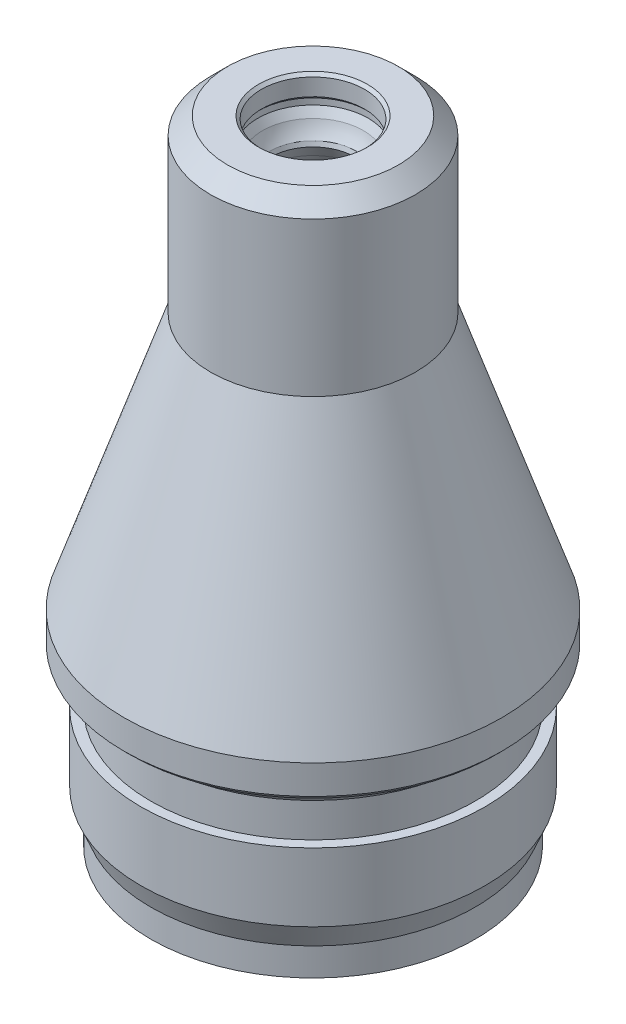
ISO-10303-21;
HEADER;
FILE_DESCRIPTION(('STEP AP214'),'2;1');
FILE_NAME('part.step','',(''),(''),'','','');
FILE_SCHEMA(('AUTOMOTIVE_DESIGN { 1 0 10303 214 1 1 1 1 }'));
ENDSEC;
DATA;
#1=APPLICATION_CONTEXT('core data for automotive mechanical design processes');
#2=APPLICATION_PROTOCOL_DEFINITION('international standard','automotive_design',2000,#1);
#3=PRODUCT_CONTEXT('',#1,'mechanical');
#4=PRODUCT('Part','Part','',(#3));
#5=PRODUCT_RELATED_PRODUCT_CATEGORY('part','',(#4));
#6=PRODUCT_DEFINITION_FORMATION('','',#4);
#7=PRODUCT_DEFINITION_CONTEXT('part definition',#1,'design');
#8=PRODUCT_DEFINITION('design','',#6,#7);
#9=PRODUCT_DEFINITION_SHAPE('','',#8);
#10=(LENGTH_UNIT() NAMED_UNIT(*) SI_UNIT(.MILLI.,.METRE.));
#11=(NAMED_UNIT(*) PLANE_ANGLE_UNIT() SI_UNIT($,.RADIAN.));
#12=(NAMED_UNIT(*) SI_UNIT($,.STERADIAN.) SOLID_ANGLE_UNIT());
#13=UNCERTAINTY_MEASURE_WITH_UNIT(LENGTH_MEASURE(1.E-05),#10,'distance_accuracy_value','');
#14=(GEOMETRIC_REPRESENTATION_CONTEXT(3) GLOBAL_UNCERTAINTY_ASSIGNED_CONTEXT((#13)) GLOBAL_UNIT_ASSIGNED_CONTEXT((#10,
#11,#12)) REPRESENTATION_CONTEXT('',''));
#15=CARTESIAN_POINT('',(0.,0.,0.));
#16=DIRECTION('',(0.,0.,1.));
#17=DIRECTION('',(1.,0.,0.));
#18=AXIS2_PLACEMENT_3D('',#15,#16,#17);
#19=CARTESIAN_POINT('',(0.,-2.,-9.5));
#20=DIRECTION('',(0.,-1.,0.));
#21=DIRECTION('',(0.,0.,-1.));
#22=AXIS2_PLACEMENT_3D('',#19,#20,#21);
#23=PLANE('',#22);
#24=CARTESIAN_POINT('',(0.,-2.,0.));
#25=DIRECTION('',(0.,-1.,0.));
#26=DIRECTION('',(0.,0.,-1.));
#27=AXIS2_PLACEMENT_3D('',#24,#25,#26);
#28=CIRCLE('',#27,5.20000000000001);
#29=CARTESIAN_POINT('',(0.,-2.,-5.20000000000001));
#30=VERTEX_POINT('',#29);
#31=EDGE_CURVE('E57',#30,#30,#28,.F.);
#32=ORIENTED_EDGE('',*,*,#31,.T.);
#33=EDGE_LOOP('',(#32));
#34=FACE_BOUND('',#33,.T.);
#35=CARTESIAN_POINT('',(0.,-2.,0.));
#36=DIRECTION('',(0.,-1.,0.));
#37=DIRECTION('',(0.,0.,-1.));
#38=AXIS2_PLACEMENT_3D('',#35,#36,#37);
#39=CIRCLE('',#38,9.5);
#40=CARTESIAN_POINT('',(0.,-2.,-9.5));
#41=VERTEX_POINT('',#40);
#42=EDGE_CURVE('E63',#41,#41,#39,.T.);
#43=ORIENTED_EDGE('',*,*,#42,.T.);
#44=EDGE_LOOP('',(#43));
#45=FACE_BOUND('',#44,.T.);
#46=ADVANCED_FACE('F31',(#34,#45),#23,.T.);
#47=CARTESIAN_POINT('',(0.,0.,0.));
#48=DIRECTION('',(0.,-1.,0.));
#49=DIRECTION('',(0.,0.,-1.));
#50=AXIS2_PLACEMENT_3D('',#47,#48,#49);
#51=CYLINDRICAL_SURFACE('',#50,9.5);
#52=CARTESIAN_POINT('',(0.,-0.374573667500014,0.));
#53=DIRECTION('',(0.,-1.,0.));
#54=DIRECTION('',(0.,0.,-1.));
#55=AXIS2_PLACEMENT_3D('',#52,#53,#54);
#56=CIRCLE('',#55,9.5);
#57=CARTESIAN_POINT('',(0.,-0.374573667500014,-9.5));
#58=VERTEX_POINT('',#57);
#59=EDGE_CURVE('E66',#58,#58,#56,.T.);
#60=ORIENTED_EDGE('',*,*,#59,.T.);
#61=EDGE_LOOP('',(#60));
#62=FACE_BOUND('',#61,.T.);
#63=ORIENTED_EDGE('',*,*,#42,.F.);
#64=EDGE_LOOP('',(#63));
#65=FACE_BOUND('',#64,.T.);
#66=ADVANCED_FACE('F169',(#62,#65),#51,.T.);
#67=CARTESIAN_POINT('',(0.,-0.374573667500014,0.));
#68=DIRECTION('',(0.,1.,0.));
#69=DIRECTION('',(0.,0.,1.));
#70=AXIS2_PLACEMENT_3D('',#67,#68,#69);
#71=CONICAL_SURFACE('',#70,9.5,0.396191832514658);
#72=CARTESIAN_POINT('',(0.,1.,0.));
#73=DIRECTION('',(0.,-1.,0.));
#74=DIRECTION('',(0.,0.,-1.));
#75=AXIS2_PLACEMENT_3D('',#72,#73,#74);
#76=CIRCLE('',#75,10.075);
#77=CARTESIAN_POINT('',(0.,1.,-10.075));
#78=VERTEX_POINT('',#77);
#79=EDGE_CURVE('E69',#78,#78,#76,.T.);
#80=ORIENTED_EDGE('',*,*,#79,.T.);
#81=EDGE_LOOP('',(#80));
#82=FACE_BOUND('',#81,.T.);
#83=ORIENTED_EDGE('',*,*,#59,.F.);
#84=EDGE_LOOP('',(#83));
#85=FACE_BOUND('',#84,.T.);
#86=ADVANCED_FACE('F175',(#82,#85),#71,.T.);
#87=CARTESIAN_POINT('',(0.,0.,0.));
#88=DIRECTION('',(0.,-1.,0.));
#89=DIRECTION('',(0.,0.,-1.));
#90=AXIS2_PLACEMENT_3D('',#87,#88,#89);
#91=CYLINDRICAL_SURFACE('',#90,10.075);
#92=CARTESIAN_POINT('',(0.,5.,0.));
#93=DIRECTION('',(0.,-1.,0.));
#94=DIRECTION('',(0.,0.,-1.));
#95=AXIS2_PLACEMENT_3D('',#92,#93,#94);
#96=CIRCLE('',#95,10.075);
#97=CARTESIAN_POINT('',(0.,5.,-10.075));
#98=VERTEX_POINT('',#97);
#99=EDGE_CURVE('E72',#98,#98,#96,.T.);
#100=ORIENTED_EDGE('',*,*,#99,.T.);
#101=EDGE_LOOP('',(#100));
#102=FACE_BOUND('',#101,.T.);
#103=ORIENTED_EDGE('',*,*,#79,.F.);
#104=EDGE_LOOP('',(#103));
#105=FACE_BOUND('',#104,.T.);
#106=ADVANCED_FACE('F263',(#102,#105),#91,.T.);
#107=CARTESIAN_POINT('',(0.,5.,-9.5));
#108=DIRECTION('',(0.,1.,0.));
#109=DIRECTION('',(0.,0.,1.));
#110=AXIS2_PLACEMENT_3D('',#107,#108,#109);
#111=PLANE('',#110);
#112=CARTESIAN_POINT('',(0.,5.,0.));
#113=DIRECTION('',(0.,-1.,0.));
#114=DIRECTION('',(0.,0.,-1.));
#115=AXIS2_PLACEMENT_3D('',#112,#113,#114);
#116=CIRCLE('',#115,9.5);
#117=CARTESIAN_POINT('',(0.,5.,-9.5));
#118=VERTEX_POINT('',#117);
#119=EDGE_CURVE('E75',#118,#118,#116,.T.);
#120=ORIENTED_EDGE('',*,*,#119,.T.);
#121=EDGE_LOOP('',(#120));
#122=FACE_BOUND('',#121,.T.);
#123=ORIENTED_EDGE('',*,*,#99,.F.);
#124=EDGE_LOOP('',(#123));
#125=FACE_BOUND('',#124,.T.);
#126=ADVANCED_FACE('F259',(#122,#125),#111,.T.);
#127=CARTESIAN_POINT('',(0.,0.,0.));
#128=DIRECTION('',(0.,-1.,0.));
#129=DIRECTION('',(0.,0.,-1.));
#130=AXIS2_PLACEMENT_3D('',#127,#128,#129);
#131=CYLINDRICAL_SURFACE('',#130,9.5);
#132=CARTESIAN_POINT('',(0.,7.,0.));
#133=DIRECTION('',(0.,-1.,0.));
#134=DIRECTION('',(0.,0.,-1.));
#135=AXIS2_PLACEMENT_3D('',#132,#133,#134);
#136=CIRCLE('',#135,9.5);
#137=CARTESIAN_POINT('',(0.,7.,-9.5));
#138=VERTEX_POINT('',#137);
#139=EDGE_CURVE('E78',#138,#138,#136,.T.);
#140=ORIENTED_EDGE('',*,*,#139,.T.);
#141=EDGE_LOOP('',(#140));
#142=FACE_BOUND('',#141,.T.);
#143=ORIENTED_EDGE('',*,*,#119,.F.);
#144=EDGE_LOOP('',(#143));
#145=FACE_BOUND('',#144,.T.);
#146=ADVANCED_FACE('F255',(#142,#145),#131,.T.);
#147=CARTESIAN_POINT('',(0.,7.,0.));
#148=DIRECTION('',(0.,1.,0.));
#149=DIRECTION('',(0.,0.,1.));
#150=AXIS2_PLACEMENT_3D('',#147,#148,#149);
#151=CONICAL_SURFACE('',#150,9.5,0.502843210927853);
#152=CARTESIAN_POINT('',(0.,8.00000000000002,0.));
#153=DIRECTION('',(0.,-1.,0.));
#154=DIRECTION('',(0.,0.,-1.));
#155=AXIS2_PLACEMENT_3D('',#152,#153,#154);
#156=CIRCLE('',#155,10.05);
#157=CARTESIAN_POINT('',(0.,8.00000000000002,-10.05));
#158=VERTEX_POINT('',#157);
#159=EDGE_CURVE('E81',#158,#158,#156,.T.);
#160=ORIENTED_EDGE('',*,*,#159,.T.);
#161=EDGE_LOOP('',(#160));
#162=FACE_BOUND('',#161,.T.);
#163=ORIENTED_EDGE('',*,*,#139,.F.);
#164=EDGE_LOOP('',(#163));
#165=FACE_BOUND('',#164,.T.);
#166=ADVANCED_FACE('F252',(#162,#165),#151,.T.);
#167=CARTESIAN_POINT('',(0.,8.00000000000002,-11.05));
#168=DIRECTION('',(0.,-1.,0.));
#169=DIRECTION('',(0.,0.,-1.));
#170=AXIS2_PLACEMENT_3D('',#167,#168,#169);
#171=PLANE('',#170);
#172=CARTESIAN_POINT('',(0.,8.00000000000002,0.));
#173=DIRECTION('',(0.,-1.,0.));
#174=DIRECTION('',(0.,0.,-1.));
#175=AXIS2_PLACEMENT_3D('',#172,#173,#174);
#176=CIRCLE('',#175,10.75);
#177=CARTESIAN_POINT('',(0.,8.00000000000002,-10.75));
#178=VERTEX_POINT('',#177);
#179=EDGE_CURVE('E38',#178,#178,#176,.T.);
#180=ORIENTED_EDGE('',*,*,#179,.T.);
#181=EDGE_LOOP('',(#180));
#182=FACE_BOUND('',#181,.T.);
#183=ORIENTED_EDGE('',*,*,#159,.F.);
#184=EDGE_LOOP('',(#183));
#185=FACE_BOUND('',#184,.T.);
#186=ADVANCED_FACE('F249',(#182,#185),#171,.T.);
#187=CARTESIAN_POINT('',(0.,0.,0.));
#188=DIRECTION('',(0.,-1.,0.));
#189=DIRECTION('',(0.,0.,-1.));
#190=AXIS2_PLACEMENT_3D('',#187,#188,#189);
#191=CYLINDRICAL_SURFACE('',#190,11.05);
#192=CARTESIAN_POINT('',(0.,8.30000000000001,0.));
#193=DIRECTION('',(0.,-1.,0.));
#194=DIRECTION('',(0.,0.,-1.));
#195=AXIS2_PLACEMENT_3D('',#192,#193,#194);
#196=CIRCLE('',#195,11.05);
#197=CARTESIAN_POINT('',(0.,8.30000000000001,-11.05));
#198=VERTEX_POINT('',#197);
#199=EDGE_CURVE('E10',#198,#198,#196,.F.);
#200=ORIENTED_EDGE('',*,*,#199,.T.);
#201=EDGE_LOOP('',(#200));
#202=FACE_BOUND('',#201,.T.);
#203=CARTESIAN_POINT('',(0.,10.,0.));
#204=DIRECTION('',(0.,-1.,0.));
#205=DIRECTION('',(0.,0.,-1.));
#206=AXIS2_PLACEMENT_3D('',#203,#204,#205);
#207=CIRCLE('',#206,11.05);
#208=CARTESIAN_POINT('',(0.,10.,-11.05));
#209=VERTEX_POINT('',#208);
#210=EDGE_CURVE('E84',#209,#209,#207,.T.);
#211=ORIENTED_EDGE('',*,*,#210,.T.);
#212=EDGE_LOOP('',(#211));
#213=FACE_BOUND('',#212,.T.);
#214=ADVANCED_FACE('F245',(#202,#213),#191,.T.);
#215=CARTESIAN_POINT('',(0.,10.,0.));
#216=DIRECTION('',(0.,-1.,0.));
#217=DIRECTION('',(0.,0.,-1.));
#218=AXIS2_PLACEMENT_3D('',#215,#216,#217);
#219=CONICAL_SURFACE('',#218,11.05,0.32474754842064);
#220=CARTESIAN_POINT('',(0.,25.,0.));
#221=DIRECTION('',(0.,-1.,0.));
#222=DIRECTION('',(0.,0.,-1.));
#223=AXIS2_PLACEMENT_3D('',#220,#221,#222);
#224=CIRCLE('',#223,6.);
#225=CARTESIAN_POINT('',(0.,25.,-6.));
#226=VERTEX_POINT('',#225);
#227=EDGE_CURVE('E87',#226,#226,#224,.T.);
#228=ORIENTED_EDGE('',*,*,#227,.T.);
#229=EDGE_LOOP('',(#228));
#230=FACE_BOUND('',#229,.T.);
#231=ORIENTED_EDGE('',*,*,#210,.F.);
#232=EDGE_LOOP('',(#231));
#233=FACE_BOUND('',#232,.T.);
#234=ADVANCED_FACE('F239',(#230,#233),#219,.T.);
#235=CARTESIAN_POINT('',(0.,0.,0.));
#236=DIRECTION('',(0.,-1.,0.));
#237=DIRECTION('',(0.,0.,-1.));
#238=AXIS2_PLACEMENT_3D('',#235,#236,#237);
#239=CYLINDRICAL_SURFACE('',#238,6.);
#240=CARTESIAN_POINT('',(0.,34.,0.));
#241=DIRECTION('',(0.,1.,0.));
#242=DIRECTION('',(0.,0.,1.));
#243=AXIS2_PLACEMENT_3D('',#240,#241,#242);
#244=CIRCLE('',#243,6.);
#245=CARTESIAN_POINT('',(0.,34.,6.));
#246=VERTEX_POINT('',#245);
#247=EDGE_CURVE('E54',#246,#246,#244,.F.);
#248=ORIENTED_EDGE('',*,*,#247,.T.);
#249=EDGE_LOOP('',(#248));
#250=FACE_BOUND('',#249,.T.);
#251=ORIENTED_EDGE('',*,*,#227,.F.);
#252=EDGE_LOOP('',(#251));
#253=FACE_BOUND('',#252,.T.);
#254=ADVANCED_FACE('F233',(#250,#253),#239,.T.);
#255=CARTESIAN_POINT('',(0.,35.,-3.18963158426858));
#256=DIRECTION('',(0.,1.,0.));
#257=DIRECTION('',(0.,0.,1.));
#258=AXIS2_PLACEMENT_3D('',#255,#256,#257);
#259=PLANE('',#258);
#260=CARTESIAN_POINT('',(0.,35.,0.));
#261=DIRECTION('',(0.,1.,0.));
#262=DIRECTION('',(0.,0.,1.));
#263=AXIS2_PLACEMENT_3D('',#260,#261,#262);
#264=CIRCLE('',#263,4.99999999999999);
#265=CARTESIAN_POINT('',(0.,35.,4.99999999999999));
#266=VERTEX_POINT('',#265);
#267=EDGE_CURVE('E51',#266,#266,#264,.T.);
#268=ORIENTED_EDGE('',*,*,#267,.T.);
#269=EDGE_LOOP('',(#268));
#270=FACE_BOUND('',#269,.T.);
#271=CARTESIAN_POINT('',(0.,35.,0.));
#272=DIRECTION('',(0.,-1.,0.));
#273=DIRECTION('',(0.,0.,-1.));
#274=AXIS2_PLACEMENT_3D('',#271,#272,#273);
#275=CIRCLE('',#274,3.18963158426858);
#276=CARTESIAN_POINT('',(0.,35.,-3.18963158426858));
#277=VERTEX_POINT('',#276);
#278=EDGE_CURVE('E90',#277,#277,#275,.T.);
#279=ORIENTED_EDGE('',*,*,#278,.T.);
#280=EDGE_LOOP('',(#279));
#281=FACE_BOUND('',#280,.T.);
#282=ADVANCED_FACE('F228',(#270,#281),#259,.T.);
#283=CARTESIAN_POINT('',(0.,35.,0.));
#284=DIRECTION('',(0.,1.,0.));
#285=DIRECTION('',(0.,0.,1.));
#286=AXIS2_PLACEMENT_3D('',#283,#284,#285);
#287=CONICAL_SURFACE('',#286,3.18963158426858,0.785398163397438);
#288=CARTESIAN_POINT('',(0.,34.8303684157314,0.));
#289=DIRECTION('',(0.,-1.,0.));
#290=DIRECTION('',(0.,0.,-1.));
#291=AXIS2_PLACEMENT_3D('',#288,#289,#290);
#292=CIRCLE('',#291,3.02);
#293=CARTESIAN_POINT('',(0.,34.8303684157314,-3.02));
#294=VERTEX_POINT('',#293);
#295=EDGE_CURVE('E93',#294,#294,#292,.T.);
#296=ORIENTED_EDGE('',*,*,#295,.T.);
#297=EDGE_LOOP('',(#296));
#298=FACE_BOUND('',#297,.T.);
#299=ORIENTED_EDGE('',*,*,#278,.F.);
#300=EDGE_LOOP('',(#299));
#301=FACE_BOUND('',#300,.T.);
#302=ADVANCED_FACE('F222',(#298,#301),#287,.F.);
#303=CARTESIAN_POINT('',(0.,0.,0.));
#304=DIRECTION('',(0.,-1.,0.));
#305=DIRECTION('',(0.,0.,-1.));
#306=AXIS2_PLACEMENT_3D('',#303,#304,#305);
#307=CYLINDRICAL_SURFACE('',#306,3.02);
#308=CARTESIAN_POINT('',(0.,33.8303684157314,0.));
#309=DIRECTION('',(0.,-1.,0.));
#310=DIRECTION('',(0.,0.,-1.));
#311=AXIS2_PLACEMENT_3D('',#308,#309,#310);
#312=CIRCLE('',#311,3.02);
#313=CARTESIAN_POINT('',(0.,33.8303684157314,-3.02));
#314=VERTEX_POINT('',#313);
#315=EDGE_CURVE('E96',#314,#314,#312,.T.);
#316=ORIENTED_EDGE('',*,*,#315,.T.);
#317=EDGE_LOOP('',(#316));
#318=FACE_BOUND('',#317,.T.);
#319=ORIENTED_EDGE('',*,*,#295,.F.);
#320=EDGE_LOOP('',(#319));
#321=FACE_BOUND('',#320,.T.);
#322=ADVANCED_FACE('F216',(#318,#321),#307,.F.);
#323=CARTESIAN_POINT('',(0.,33.8303684157314,0.));
#324=DIRECTION('',(0.,-1.,0.));
#325=DIRECTION('',(0.,0.,-1.));
#326=AXIS2_PLACEMENT_3D('',#323,#324,#325);
#327=CONICAL_SURFACE('',#326,3.02,0.785398163397453);
#328=CARTESIAN_POINT('',(0.,33.6203777303055,0.));
#329=DIRECTION('',(0.,-1.,0.));
#330=DIRECTION('',(0.,0.,-1.));
#331=AXIS2_PLACEMENT_3D('',#328,#329,#330);
#332=CIRCLE('',#331,3.22999068542591);
#333=CARTESIAN_POINT('',(0.,33.6203777303055,-3.22999068542591));
#334=VERTEX_POINT('',#333);
#335=EDGE_CURVE('E99',#334,#334,#332,.T.);
#336=ORIENTED_EDGE('',*,*,#335,.T.);
#337=EDGE_LOOP('',(#336));
#338=FACE_BOUND('',#337,.T.);
#339=ORIENTED_EDGE('',*,*,#315,.F.);
#340=EDGE_LOOP('',(#339));
#341=FACE_BOUND('',#340,.T.);
#342=ADVANCED_FACE('F210',(#338,#341),#327,.F.);
#343=CARTESIAN_POINT('',(0.,0.,0.));
#344=DIRECTION('',(0.,-1.,0.));
#345=DIRECTION('',(0.,0.,-1.));
#346=AXIS2_PLACEMENT_3D('',#343,#344,#345);
#347=CYLINDRICAL_SURFACE('',#346,3.22999068542591);
#348=CARTESIAN_POINT('',(0.,33.2603970035526,0.));
#349=DIRECTION('',(0.,-1.,0.));
#350=DIRECTION('',(0.,0.,-1.));
#351=AXIS2_PLACEMENT_3D('',#348,#349,#350);
#352=CIRCLE('',#351,3.22999068542591);
#353=CARTESIAN_POINT('',(0.,33.2603970035526,-3.22999068542591));
#354=VERTEX_POINT('',#353);
#355=EDGE_CURVE('E102',#354,#354,#352,.T.);
#356=ORIENTED_EDGE('',*,*,#355,.T.);
#357=EDGE_LOOP('',(#356));
#358=FACE_BOUND('',#357,.T.);
#359=ORIENTED_EDGE('',*,*,#335,.F.);
#360=EDGE_LOOP('',(#359));
#361=FACE_BOUND('',#360,.T.);
#362=ADVANCED_FACE('F204',(#358,#361),#347,.F.);
#363=CARTESIAN_POINT('',(0.,33.2603970035526,0.));
#364=DIRECTION('',(0.,1.,0.));
#365=DIRECTION('',(0.,0.,1.));
#366=AXIS2_PLACEMENT_3D('',#363,#364,#365);
#367=CONICAL_SURFACE('',#366,3.22999068542591,0.531636973669674);
#368=CARTESIAN_POINT('',(0.,32.7785523916032,0.));
#369=DIRECTION('',(0.,-1.,0.));
#370=DIRECTION('',(0.,0.,-1.));
#371=AXIS2_PLACEMENT_3D('',#368,#369,#370);
#372=CIRCLE('',#371,2.94660916204067);
#373=CARTESIAN_POINT('',(0.,32.7785523916032,-2.94660916204067));
#374=VERTEX_POINT('',#373);
#375=EDGE_CURVE('E105',#374,#374,#372,.T.);
#376=ORIENTED_EDGE('',*,*,#375,.T.);
#377=EDGE_LOOP('',(#376));
#378=FACE_BOUND('',#377,.T.);
#379=ORIENTED_EDGE('',*,*,#355,.F.);
#380=EDGE_LOOP('',(#379));
#381=FACE_BOUND('',#380,.T.);
#382=ADVANCED_FACE('F198',(#378,#381),#367,.F.);
#383=CARTESIAN_POINT('',(0.,33.741617522411,0.));
#384=DIRECTION('',(0.,-1.,0.));
#385=DIRECTION('',(0.,0.,-1.));
#386=AXIS2_PLACEMENT_3D('',#383,#384,#385);
#387=SPHERICAL_SURFACE('',#386,3.1);
#388=CARTESIAN_POINT('',(0.,31.9448640025299,0.));
#389=DIRECTION('',(0.,1.,0.));
#390=DIRECTION('',(0.,0.,1.));
#391=AXIS2_PLACEMENT_3D('',#388,#389,#390);
#392=CIRCLE('',#391,2.52619808977733);
#393=CARTESIAN_POINT('',(0.,31.9448640025299,-2.52619808977733));
#394=VERTEX_POINT('',#393);
#395=EDGE_CURVE('E46',#394,#394,#392,.F.);
#396=CARTESIAN_POINT('',(0.,31.9448640025299,-2.52619808977733));
#397=CARTESIAN_POINT('',(0.,31.9528199831202,-2.53185676744438));
#398=CARTESIAN_POINT('',(0.,31.9608026974373,-2.53747785800583));
#399=CARTESIAN_POINT('',(0.,31.9768208772162,-2.54864436846585));
#400=CARTESIAN_POINT('',(0.,31.9848563426781,-2.55418978836442));
#401=CARTESIAN_POINT('',(0.,32.0009793084382,-2.56520446104701));
#402=CARTESIAN_POINT('',(0.,32.0090668087364,-2.57067371383103));
#403=CARTESIAN_POINT('',(0.,32.0252931219539,-2.58153556444201));
#404=CARTESIAN_POINT('',(0.,32.0334319348731,-2.58692816226898));
#405=CARTESIAN_POINT('',(0.,32.0497601468749,-2.59763622148119));
#406=CARTESIAN_POINT('',(0.,32.0579495459574,-2.60295168286643));
#407=CARTESIAN_POINT('',(0.,32.0743781992218,-2.6135049947262));
#408=CARTESIAN_POINT('',(0.,32.0826174534036,-2.61874284520072));
#409=CARTESIAN_POINT('',(0.,32.0991450813764,-2.62914046766336));
#410=CARTESIAN_POINT('',(0.,32.1074334551674,-2.63430023965147));
#411=CARTESIAN_POINT('',(0.,32.124058582477,-2.64454124454477));
#412=CARTESIAN_POINT('',(0.,32.1323953359956,-2.64962247744996));
#413=CARTESIAN_POINT('',(0.,32.1491164785622,-2.65970595058936));
#414=CARTESIAN_POINT('',(0.,32.1575008676101,-2.66470819082357));
#415=CARTESIAN_POINT('',(0.,32.174316532784,-2.6746332320851));
#416=CARTESIAN_POINT('',(0.,32.18274780891,-2.67955603311241));
#417=CARTESIAN_POINT('',(0.,32.1996564956036,-2.68932175651536));
#418=CARTESIAN_POINT('',(0.,32.2081339061712,-2.69416467889099));
#419=CARTESIAN_POINT('',(0.,32.225134104993,-2.70377021267637));
#420=CARTESIAN_POINT('',(0.,32.2336568932473,-2.70853282408612));
#421=CARTESIAN_POINT('',(0.,32.250747086637,-2.71797731079468));
#422=CARTESIAN_POINT('',(0.,32.2593144917724,-2.72265918609348));
#423=CARTESIAN_POINT('',(0.,32.2764931541358,-2.73194178264217));
#424=CARTESIAN_POINT('',(0.,32.2851044113639,-2.73654250389204));
#425=CARTESIAN_POINT('',(0.,32.3023700092099,-2.74566238164929));
#426=CARTESIAN_POINT('',(0.,32.3110243498277,-2.75018153815666));
#427=CARTESIAN_POINT('',(0.,32.3283753419042,-2.75913788301637));
#428=CARTESIAN_POINT('',(0.,32.3370719933628,-2.76357507136871));
#429=CARTESIAN_POINT('',(0.,32.3545068307951,-2.77236708382289));
#430=CARTESIAN_POINT('',(0.,32.3632450167687,-2.77672190792473));
#431=CARTESIAN_POINT('',(0.,32.3807621431974,-2.78534880313491));
#432=CARTESIAN_POINT('',(0.,32.3895410836524,-2.78962087424323));
#433=CARTESIAN_POINT('',(0.,32.4071389353723,-2.79808188211047));
#434=CARTESIAN_POINT('',(0.,32.4159578466371,-2.80227081886938));
#435=CARTESIAN_POINT('',(0.,32.433634852737,-2.81056518410305));
#436=CARTESIAN_POINT('',(0.,32.442492947572,-2.81467061257781));
#437=CARTESIAN_POINT('',(0.,32.4602475300747,-2.82279759476302));
#438=CARTESIAN_POINT('',(0.,32.4691440177424,-2.82681914847346));
#439=CARTESIAN_POINT('',(0.,32.4869745917458,-2.83477802213712));
#440=CARTESIAN_POINT('',(0.,32.4959086780815,-2.83871534209033));
#441=CARTESIAN_POINT('',(0.,32.5138136518998,-2.84650539676593));
#442=CARTESIAN_POINT('',(0.,32.5227845393825,-2.85035813148831));
#443=CARTESIAN_POINT('',(0.,32.5407623146886,-2.85797867177937));
#444=CARTESIAN_POINT('',(0.,32.549769202512,-2.86174647734806));
#445=CARTESIAN_POINT('',(0.,32.56781817448,-2.86919682299005));
#446=CARTESIAN_POINT('',(0.,32.5768602586244,-2.87287936306336));
#447=CARTESIAN_POINT('',(0.,32.5949788160725,-2.88015884898509));
#448=CARTESIAN_POINT('',(0.,32.6040552893762,-2.88375579483353));
#449=CARTESIAN_POINT('',(0.,32.6222418149118,-2.8908637712139));
#450=CARTESIAN_POINT('',(0.,32.6313518671438,-2.89437480174584));
#451=CARTESIAN_POINT('',(0.,32.6496047373044,-2.90131063408179));
#452=CARTESIAN_POINT('',(0.,32.6587475552329,-2.90473543588581));
#453=CARTESIAN_POINT('',(0.,32.6770651406433,-2.91149850501167));
#454=CARTESIAN_POINT('',(0.,32.6862399081251,-2.91483677233352));
#455=CARTESIAN_POINT('',(0.,32.7046205735962,-2.92142647461559));
#456=CARTESIAN_POINT('',(0.,32.7138264715854,-2.92467790957582));
#457=CARTESIAN_POINT('',(0.,32.7322685764355,-2.9310936564463));
#458=CARTESIAN_POINT('',(0.,32.7415047832963,-2.93425796835655));
#459=CARTESIAN_POINT('',(0.,32.7600066808427,-2.94049918830659));
#460=CARTESIAN_POINT('',(0.,32.7692723715284,-2.94357609634637));
#461=CARTESIAN_POINT('',(0.,32.7785523916032,-2.94660916204067));
#462=B_SPLINE_CURVE_WITH_KNOTS('',3,(#396,#397,#398,#399,#400,#401,#402,#403,#404,#405,#406,
#407,#408,#409,#410,#411,#412,#413,#414,#415,#416,#417,#418,#419,#420,#421,#422,#423,#424,#425,
#426,#427,#428,#429,#430,#431,#432,#433,#434,#435,#436,#437,#438,#439,#440,#441,#442,#443,#444,
#445,#446,#447,#448,#449,#450,#451,#452,#453,#454,#455,#456,#457,#458,#459,#460,#461),
.UNSPECIFIED.,.F.,.F.,(4,2,2,2,2,2,2,2,2,2,2,2,2,2,2,2,2,2,2,2,2,2,2,2,2,2,2,2,2,2,2,2,4),(0.,
0.0292892122946374,0.0585784245892745,0.0878676368839082,0.11715684917855,0.146446061473185,
0.175735273767822,0.205024486062458,0.234313698357099,0.263602910651734,0.292892122946371,
0.322181335241009,0.351470547535651,0.380759759830287,0.410048972124925,0.43933818441956,
0.468627396714199,0.49791660900884,0.527205821303472,0.556495033598111,0.585784245892751,
0.615073458187389,0.644362670482022,0.67365188277666,0.702941095071299,0.732230307365939,
0.761519519660574,0.790808731955211,0.820097944249852,0.849387156544488,0.878676368839125,
0.907965581133763,0.937254793428404),.UNSPECIFIED.);
#463=EDGE_CURVE('BSEAM194',#394,#374,#462,.T.);
#464=ORIENTED_EDGE('',*,*,#395,.T.);
#465=ORIENTED_EDGE('',*,*,#375,.F.);
#466=ORIENTED_EDGE('',*,*,#463,.T.);
#467=ORIENTED_EDGE('',*,*,#463,.F.);
#468=EDGE_LOOP('',(#464,#466,#465,#467));
#469=FACE_BOUND('',#468,.T.);
#470=ADVANCED_FACE('F194',(#469),#387,.F.);
#471=CARTESIAN_POINT('',(0.,31.7785523916032,0.));
#472=DIRECTION('',(0.,-1.,0.));
#473=DIRECTION('',(0.,0.,-1.));
#474=AXIS2_PLACEMENT_3D('',#471,#472,#473);
#475=CONICAL_SURFACE('',#474,2.39924473370399,0.478156977307108);
#476=CARTESIAN_POINT('',(0.,31.6897679430677,0.));
#477=DIRECTION('',(0.,1.,0.));
#478=DIRECTION('',(0.,0.,1.));
#479=AXIS2_PLACEMENT_3D('',#476,#477,#478);
#480=CIRCLE('',#479,2.44525909774657);
#481=CARTESIAN_POINT('',(0.,31.6897679430677,2.44525909774657));
#482=VERTEX_POINT('',#481);
#483=EDGE_CURVE('E42',#482,#482,#480,.T.);
#484=ORIENTED_EDGE('',*,*,#483,.T.);
#485=EDGE_LOOP('',(#484));
#486=FACE_BOUND('',#485,.T.);
#487=CARTESIAN_POINT('',(0.,31.,0.));
#488=DIRECTION('',(0.,-1.,0.));
#489=DIRECTION('',(0.,0.,-1.));
#490=AXIS2_PLACEMENT_3D('',#487,#488,#489);
#491=CIRCLE('',#490,2.80274550173677);
#492=CARTESIAN_POINT('',(0.,31.,-2.80274550173677));
#493=VERTEX_POINT('',#492);
#494=EDGE_CURVE('E108',#493,#493,#491,.T.);
#495=ORIENTED_EDGE('',*,*,#494,.T.);
#496=EDGE_LOOP('',(#495));
#497=FACE_BOUND('',#496,.T.);
#498=ADVANCED_FACE('F197',(#486,#497),#475,.F.);
#499=CARTESIAN_POINT('',(0.,29.4305305362023,0.));
#500=DIRECTION('',(0.,-1.,0.));
#501=DIRECTION('',(0.,0.,-1.));
#502=AXIS2_PLACEMENT_3D('',#499,#500,#501);
#503=CONICAL_SURFACE('',#502,3.53372825779615,0.435875390357633);
#504=CARTESIAN_POINT('',(0.,28.,0.));
#505=DIRECTION('',(0.,-1.,0.));
#506=DIRECTION('',(0.,0.,-1.));
#507=AXIS2_PLACEMENT_3D('',#504,#505,#506);
#508=CIRCLE('',#507,4.2);
#509=CARTESIAN_POINT('',(0.,28.,-4.2));
#510=VERTEX_POINT('',#509);
#511=EDGE_CURVE('E111',#510,#510,#508,.T.);
#512=ORIENTED_EDGE('',*,*,#511,.T.);
#513=EDGE_LOOP('',(#512));
#514=FACE_BOUND('',#513,.T.);
#515=ORIENTED_EDGE('',*,*,#494,.F.);
#516=EDGE_LOOP('',(#515));
#517=FACE_BOUND('',#516,.T.);
#518=ADVANCED_FACE('F354',(#514,#517),#503,.F.);
#519=CARTESIAN_POINT('',(0.,0.,0.));
#520=DIRECTION('',(0.,-1.,0.));
#521=DIRECTION('',(0.,0.,-1.));
#522=AXIS2_PLACEMENT_3D('',#519,#520,#521);
#523=CYLINDRICAL_SURFACE('',#522,4.19999999999998);
#524=CARTESIAN_POINT('',(0.,14.5000000000001,0.));
#525=DIRECTION('',(0.,-1.,0.));
#526=DIRECTION('',(0.,0.,-1.));
#527=AXIS2_PLACEMENT_3D('',#524,#525,#526);
#528=CIRCLE('',#527,4.19999999999996);
#529=CARTESIAN_POINT('',(0.,14.5000000000001,-4.19999999999996));
#530=VERTEX_POINT('',#529);
#531=EDGE_CURVE('E114',#530,#530,#528,.T.);
#532=ORIENTED_EDGE('',*,*,#531,.T.);
#533=EDGE_LOOP('',(#532));
#534=FACE_BOUND('',#533,.T.);
#535=ORIENTED_EDGE('',*,*,#511,.F.);
#536=EDGE_LOOP('',(#535));
#537=FACE_BOUND('',#536,.T.);
#538=ADVANCED_FACE('F373',(#534,#537),#523,.F.);
#539=CARTESIAN_POINT('',(0.,14.5000000000001,0.));
#540=DIRECTION('',(0.,-1.,0.));
#541=DIRECTION('',(0.,0.,-1.));
#542=AXIS2_PLACEMENT_3D('',#539,#540,#541);
#543=CONICAL_SURFACE('',#542,4.19999999999996,0.785398241500594);
#544=CARTESIAN_POINT('',(0.,14.0000000781032,0.));
#545=DIRECTION('',(0.,-1.,0.));
#546=DIRECTION('',(0.,0.,-1.));
#547=AXIS2_PLACEMENT_3D('',#544,#545,#546);
#548=CIRCLE('',#547,4.69999999999998);
#549=CARTESIAN_POINT('',(0.,14.0000000781032,-4.69999999999998));
#550=VERTEX_POINT('',#549);
#551=EDGE_CURVE('E117',#550,#550,#548,.T.);
#552=ORIENTED_EDGE('',*,*,#551,.T.);
#553=EDGE_LOOP('',(#552));
#554=FACE_BOUND('',#553,.T.);
#555=ORIENTED_EDGE('',*,*,#531,.F.);
#556=EDGE_LOOP('',(#555));
#557=FACE_BOUND('',#556,.T.);
#558=ADVANCED_FACE('F382',(#554,#557),#543,.F.);
#559=CARTESIAN_POINT('',(0.,0.,0.));
#560=DIRECTION('',(0.,-1.,0.));
#561=DIRECTION('',(0.,0.,-1.));
#562=AXIS2_PLACEMENT_3D('',#559,#560,#561);
#563=CYLINDRICAL_SURFACE('',#562,4.69999999999998);
#564=CARTESIAN_POINT('',(0.,13.5000000781032,0.));
#565=DIRECTION('',(0.,-1.,0.));
#566=DIRECTION('',(0.,0.,-1.));
#567=AXIS2_PLACEMENT_3D('',#564,#565,#566);
#568=CIRCLE('',#567,4.69999999999998);
#569=CARTESIAN_POINT('',(0.,13.5000000781032,-4.69999999999998));
#570=VERTEX_POINT('',#569);
#571=EDGE_CURVE('E120',#570,#570,#568,.T.);
#572=ORIENTED_EDGE('',*,*,#571,.T.);
#573=EDGE_LOOP('',(#572));
#574=FACE_BOUND('',#573,.T.);
#575=ORIENTED_EDGE('',*,*,#551,.F.);
#576=EDGE_LOOP('',(#575));
#577=FACE_BOUND('',#576,.T.);
#578=ADVANCED_FACE('F390',(#574,#577),#563,.F.);
#579=CARTESIAN_POINT('',(0.,13.5000000781032,0.));
#580=DIRECTION('',(0.,1.,0.));
#581=DIRECTION('',(0.,0.,1.));
#582=AXIS2_PLACEMENT_3D('',#579,#580,#581);
#583=CONICAL_SURFACE('',#582,4.69999999999998,0.785398085294315);
#584=CARTESIAN_POINT('',(0.,13.0000000000001,0.));
#585=DIRECTION('',(0.,-1.,0.));
#586=DIRECTION('',(0.,0.,-1.));
#587=AXIS2_PLACEMENT_3D('',#584,#585,#586);
#588=CIRCLE('',#587,4.19999999999996);
#589=CARTESIAN_POINT('',(0.,13.0000000000001,-4.19999999999996));
#590=VERTEX_POINT('',#589);
#591=EDGE_CURVE('E123',#590,#590,#588,.T.);
#592=ORIENTED_EDGE('',*,*,#591,.T.);
#593=EDGE_LOOP('',(#592));
#594=FACE_BOUND('',#593,.T.);
#595=ORIENTED_EDGE('',*,*,#571,.F.);
#596=EDGE_LOOP('',(#595));
#597=FACE_BOUND('',#596,.T.);
#598=ADVANCED_FACE('F398',(#594,#597),#583,.F.);
#599=CARTESIAN_POINT('',(0.,0.,0.));
#600=DIRECTION('',(0.,-1.,0.));
#601=DIRECTION('',(0.,0.,-1.));
#602=AXIS2_PLACEMENT_3D('',#599,#600,#601);
#603=CYLINDRICAL_SURFACE('',#602,4.19999999999996);
#604=CARTESIAN_POINT('',(0.,11.5000000000001,0.));
#605=DIRECTION('',(0.,-1.,0.));
#606=DIRECTION('',(0.,0.,-1.));
#607=AXIS2_PLACEMENT_3D('',#604,#605,#606);
#608=CIRCLE('',#607,4.19999999999997);
#609=CARTESIAN_POINT('',(0.,11.5000000000001,-4.19999999999997));
#610=VERTEX_POINT('',#609);
#611=EDGE_CURVE('E126',#610,#610,#608,.T.);
#612=ORIENTED_EDGE('',*,*,#611,.T.);
#613=EDGE_LOOP('',(#612));
#614=FACE_BOUND('',#613,.T.);
#615=ORIENTED_EDGE('',*,*,#591,.F.);
#616=EDGE_LOOP('',(#615));
#617=FACE_BOUND('',#616,.T.);
#618=ADVANCED_FACE('F406',(#614,#617),#603,.F.);
#619=CARTESIAN_POINT('',(0.,11.5000000000001,0.));
#620=DIRECTION('',(0.,-1.,0.));
#621=DIRECTION('',(0.,0.,-1.));
#622=AXIS2_PLACEMENT_3D('',#619,#620,#621);
#623=CONICAL_SURFACE('',#622,4.19999999999997,0.785398241500594);
#624=CARTESIAN_POINT('',(0.,11.0000000781032,0.));
#625=DIRECTION('',(0.,-1.,0.));
#626=DIRECTION('',(0.,0.,-1.));
#627=AXIS2_PLACEMENT_3D('',#624,#625,#626);
#628=CIRCLE('',#627,4.69999999999999);
#629=CARTESIAN_POINT('',(0.,11.0000000781032,-4.69999999999999));
#630=VERTEX_POINT('',#629);
#631=EDGE_CURVE('E129',#630,#630,#628,.T.);
#632=ORIENTED_EDGE('',*,*,#631,.T.);
#633=EDGE_LOOP('',(#632));
#634=FACE_BOUND('',#633,.T.);
#635=ORIENTED_EDGE('',*,*,#611,.F.);
#636=EDGE_LOOP('',(#635));
#637=FACE_BOUND('',#636,.T.);
#638=ADVANCED_FACE('F414',(#634,#637),#623,.F.);
#639=CARTESIAN_POINT('',(0.,0.,0.));
#640=DIRECTION('',(0.,-1.,0.));
#641=DIRECTION('',(0.,0.,-1.));
#642=AXIS2_PLACEMENT_3D('',#639,#640,#641);
#643=CYLINDRICAL_SURFACE('',#642,4.69999999999999);
#644=CARTESIAN_POINT('',(0.,10.5000000781032,0.));
#645=DIRECTION('',(0.,-1.,0.));
#646=DIRECTION('',(0.,0.,-1.));
#647=AXIS2_PLACEMENT_3D('',#644,#645,#646);
#648=CIRCLE('',#647,4.69999999999999);
#649=CARTESIAN_POINT('',(0.,10.5000000781032,-4.69999999999999));
#650=VERTEX_POINT('',#649);
#651=EDGE_CURVE('E132',#650,#650,#648,.T.);
#652=ORIENTED_EDGE('',*,*,#651,.T.);
#653=EDGE_LOOP('',(#652));
#654=FACE_BOUND('',#653,.T.);
#655=ORIENTED_EDGE('',*,*,#631,.F.);
#656=EDGE_LOOP('',(#655));
#657=FACE_BOUND('',#656,.T.);
#658=ADVANCED_FACE('F422',(#654,#657),#643,.F.);
#659=CARTESIAN_POINT('',(0.,10.5000000781032,0.));
#660=DIRECTION('',(0.,1.,0.));
#661=DIRECTION('',(0.,0.,1.));
#662=AXIS2_PLACEMENT_3D('',#659,#660,#661);
#663=CONICAL_SURFACE('',#662,4.69999999999999,0.785398085294315);
#664=CARTESIAN_POINT('',(0.,10.0000000000001,0.));
#665=DIRECTION('',(0.,-1.,0.));
#666=DIRECTION('',(0.,0.,-1.));
#667=AXIS2_PLACEMENT_3D('',#664,#665,#666);
#668=CIRCLE('',#667,4.19999999999997);
#669=CARTESIAN_POINT('',(0.,10.0000000000001,-4.19999999999997));
#670=VERTEX_POINT('',#669);
#671=EDGE_CURVE('E135',#670,#670,#668,.T.);
#672=ORIENTED_EDGE('',*,*,#671,.T.);
#673=EDGE_LOOP('',(#672));
#674=FACE_BOUND('',#673,.T.);
#675=ORIENTED_EDGE('',*,*,#651,.F.);
#676=EDGE_LOOP('',(#675));
#677=FACE_BOUND('',#676,.T.);
#678=ADVANCED_FACE('F430',(#674,#677),#663,.F.);
#679=CARTESIAN_POINT('',(0.,0.,0.));
#680=DIRECTION('',(0.,-1.,0.));
#681=DIRECTION('',(0.,0.,-1.));
#682=AXIS2_PLACEMENT_3D('',#679,#680,#681);
#683=CYLINDRICAL_SURFACE('',#682,4.19999999999997);
#684=CARTESIAN_POINT('',(0.,8.5000000000001,0.));
#685=DIRECTION('',(0.,-1.,0.));
#686=DIRECTION('',(0.,0.,-1.));
#687=AXIS2_PLACEMENT_3D('',#684,#685,#686);
#688=CIRCLE('',#687,4.19999999999998);
#689=CARTESIAN_POINT('',(0.,8.5000000000001,-4.19999999999998));
#690=VERTEX_POINT('',#689);
#691=EDGE_CURVE('E138',#690,#690,#688,.T.);
#692=ORIENTED_EDGE('',*,*,#691,.T.);
#693=EDGE_LOOP('',(#692));
#694=FACE_BOUND('',#693,.T.);
#695=ORIENTED_EDGE('',*,*,#671,.F.);
#696=EDGE_LOOP('',(#695));
#697=FACE_BOUND('',#696,.T.);
#698=ADVANCED_FACE('F438',(#694,#697),#683,.F.);
#699=CARTESIAN_POINT('',(0.,8.5000000000001,0.));
#700=DIRECTION('',(0.,-1.,0.));
#701=DIRECTION('',(0.,0.,-1.));
#702=AXIS2_PLACEMENT_3D('',#699,#700,#701);
#703=CONICAL_SURFACE('',#702,4.19999999999998,0.785398241500596);
#704=CARTESIAN_POINT('',(0.,8.00000007810323,0.));
#705=DIRECTION('',(0.,-1.,0.));
#706=DIRECTION('',(0.,0.,-1.));
#707=AXIS2_PLACEMENT_3D('',#704,#705,#706);
#708=CIRCLE('',#707,4.7);
#709=CARTESIAN_POINT('',(0.,8.00000007810323,-4.7));
#710=VERTEX_POINT('',#709);
#711=EDGE_CURVE('E141',#710,#710,#708,.T.);
#712=ORIENTED_EDGE('',*,*,#711,.T.);
#713=EDGE_LOOP('',(#712));
#714=FACE_BOUND('',#713,.T.);
#715=ORIENTED_EDGE('',*,*,#691,.F.);
#716=EDGE_LOOP('',(#715));
#717=FACE_BOUND('',#716,.T.);
#718=ADVANCED_FACE('F446',(#714,#717),#703,.F.);
#719=CARTESIAN_POINT('',(0.,0.,0.));
#720=DIRECTION('',(0.,-1.,0.));
#721=DIRECTION('',(0.,0.,-1.));
#722=AXIS2_PLACEMENT_3D('',#719,#720,#721);
#723=CYLINDRICAL_SURFACE('',#722,4.7);
#724=CARTESIAN_POINT('',(0.,7.50000007810323,0.));
#725=DIRECTION('',(0.,-1.,0.));
#726=DIRECTION('',(0.,0.,-1.));
#727=AXIS2_PLACEMENT_3D('',#724,#725,#726);
#728=CIRCLE('',#727,4.7);
#729=CARTESIAN_POINT('',(0.,7.50000007810323,-4.7));
#730=VERTEX_POINT('',#729);
#731=EDGE_CURVE('E144',#730,#730,#728,.T.);
#732=ORIENTED_EDGE('',*,*,#731,.T.);
#733=EDGE_LOOP('',(#732));
#734=FACE_BOUND('',#733,.T.);
#735=ORIENTED_EDGE('',*,*,#711,.F.);
#736=EDGE_LOOP('',(#735));
#737=FACE_BOUND('',#736,.T.);
#738=ADVANCED_FACE('F166',(#734,#737),#723,.F.);
#739=CARTESIAN_POINT('',(0.,7.50000007810323,0.));
#740=DIRECTION('',(0.,1.,0.));
#741=DIRECTION('',(0.,0.,1.));
#742=AXIS2_PLACEMENT_3D('',#739,#740,#741);
#743=CONICAL_SURFACE('',#742,4.7,0.785398085294315);
#744=CARTESIAN_POINT('',(0.,7.00000000000006,0.));
#745=DIRECTION('',(0.,-1.,0.));
#746=DIRECTION('',(0.,0.,-1.));
#747=AXIS2_PLACEMENT_3D('',#744,#745,#746);
#748=CIRCLE('',#747,4.19999999999998);
#749=CARTESIAN_POINT('',(0.,7.00000000000006,-4.19999999999998));
#750=VERTEX_POINT('',#749);
#751=EDGE_CURVE('E147',#750,#750,#748,.T.);
#752=ORIENTED_EDGE('',*,*,#751,.T.);
#753=EDGE_LOOP('',(#752));
#754=FACE_BOUND('',#753,.T.);
#755=ORIENTED_EDGE('',*,*,#731,.F.);
#756=EDGE_LOOP('',(#755));
#757=FACE_BOUND('',#756,.T.);
#758=ADVANCED_FACE('F151',(#754,#757),#743,.F.);
#759=CARTESIAN_POINT('',(0.,0.,0.));
#760=DIRECTION('',(0.,-1.,0.));
#761=DIRECTION('',(0.,0.,-1.));
#762=AXIS2_PLACEMENT_3D('',#759,#760,#761);
#763=CYLINDRICAL_SURFACE('',#762,4.2);
#764=CARTESIAN_POINT('',(0.,-0.99999999999999,0.));
#765=DIRECTION('',(0.,-1.,0.));
#766=DIRECTION('',(0.,0.,-1.));
#767=AXIS2_PLACEMENT_3D('',#764,#765,#766);
#768=CIRCLE('',#767,4.2);
#769=CARTESIAN_POINT('',(0.,-0.99999999999999,-4.2));
#770=VERTEX_POINT('',#769);
#771=EDGE_CURVE('E60',#770,#770,#768,.T.);
#772=ORIENTED_EDGE('',*,*,#771,.T.);
#773=EDGE_LOOP('',(#772));
#774=FACE_BOUND('',#773,.T.);
#775=ORIENTED_EDGE('',*,*,#751,.F.);
#776=EDGE_LOOP('',(#775));
#777=FACE_BOUND('',#776,.T.);
#778=ADVANCED_FACE('F154',(#774,#777),#763,.F.);
#779=CARTESIAN_POINT('',(0.,-0.99999999999999,0.));
#780=DIRECTION('',(0.,-1.,0.));
#781=DIRECTION('',(0.,0.,-1.));
#782=AXIS2_PLACEMENT_3D('',#779,#780,#781);
#783=CONICAL_SURFACE('',#782,4.2,0.785398163397448);
#784=ORIENTED_EDGE('',*,*,#31,.F.);
#785=EDGE_LOOP('',(#784));
#786=FACE_BOUND('',#785,.T.);
#787=ORIENTED_EDGE('',*,*,#771,.F.);
#788=EDGE_LOOP('',(#787));
#789=FACE_BOUND('',#788,.T.);
#790=ADVANCED_FACE('F156',(#786,#789),#783,.F.);
#791=CARTESIAN_POINT('',(0.,34.,0.));
#792=DIRECTION('',(0.,-1.,0.));
#793=DIRECTION('',(0.,0.,-1.));
#794=AXIS2_PLACEMENT_3D('',#791,#792,#793);
#795=CONICAL_SURFACE('',#794,6.,0.785398163397451);
#796=ORIENTED_EDGE('',*,*,#267,.F.);
#797=EDGE_LOOP('',(#796));
#798=FACE_BOUND('',#797,.T.);
#799=ORIENTED_EDGE('',*,*,#247,.F.);
#800=EDGE_LOOP('',(#799));
#801=FACE_BOUND('',#800,.T.);
#802=ADVANCED_FACE('F163',(#798,#801),#795,.T.);
#803=CARTESIAN_POINT('',(0.,31.9448640025299,0.));
#804=DIRECTION('',(0.,1.,0.));
#805=DIRECTION('',(0.,0.,1.));
#806=AXIS2_PLACEMENT_3D('',#803,#804,#805);
#807=CONICAL_SURFACE('',#806,2.52619808977734,0.307241186090358);
#808=ORIENTED_EDGE('',*,*,#483,.F.);
#809=EDGE_LOOP('',(#808));
#810=FACE_BOUND('',#809,.T.);
#811=ORIENTED_EDGE('',*,*,#395,.F.);
#812=EDGE_LOOP('',(#811));
#813=FACE_BOUND('',#812,.T.);
#814=ADVANCED_FACE('F182',(#810,#813),#807,.F.);
#815=CARTESIAN_POINT('',(0.,8.00000000000002,0.));
#816=DIRECTION('',(0.,1.,0.));
#817=DIRECTION('',(0.,0.,1.));
#818=AXIS2_PLACEMENT_3D('',#815,#816,#817);
#819=CONICAL_SURFACE('',#818,10.75,0.78539816339746);
#820=ORIENTED_EDGE('',*,*,#199,.F.);
#821=EDGE_LOOP('',(#820));
#822=FACE_BOUND('',#821,.T.);
#823=ORIENTED_EDGE('',*,*,#179,.F.);
#824=EDGE_LOOP('',(#823));
#825=FACE_BOUND('',#824,.T.);
#826=ADVANCED_FACE('F33',(#822,#825),#819,.T.);
#827=CLOSED_SHELL('',(#46,#66,#86,#106,#126,#146,#166,#186,#214,#234,#254,#282,#302,#322,#342,
#362,#382,#470,#498,#518,#538,#558,#578,#598,#618,#638,#658,#678,#698,#718,#738,#758,#778,#790,
#802,#814,#826));
#828=MANIFOLD_SOLID_BREP('B2',#827);
#829=ADVANCED_BREP_SHAPE_REPRESENTATION('',(#18,#828),#14);
#830=SHAPE_DEFINITION_REPRESENTATION(#9,#829);
ENDSEC;
END-ISO-10303-21;
